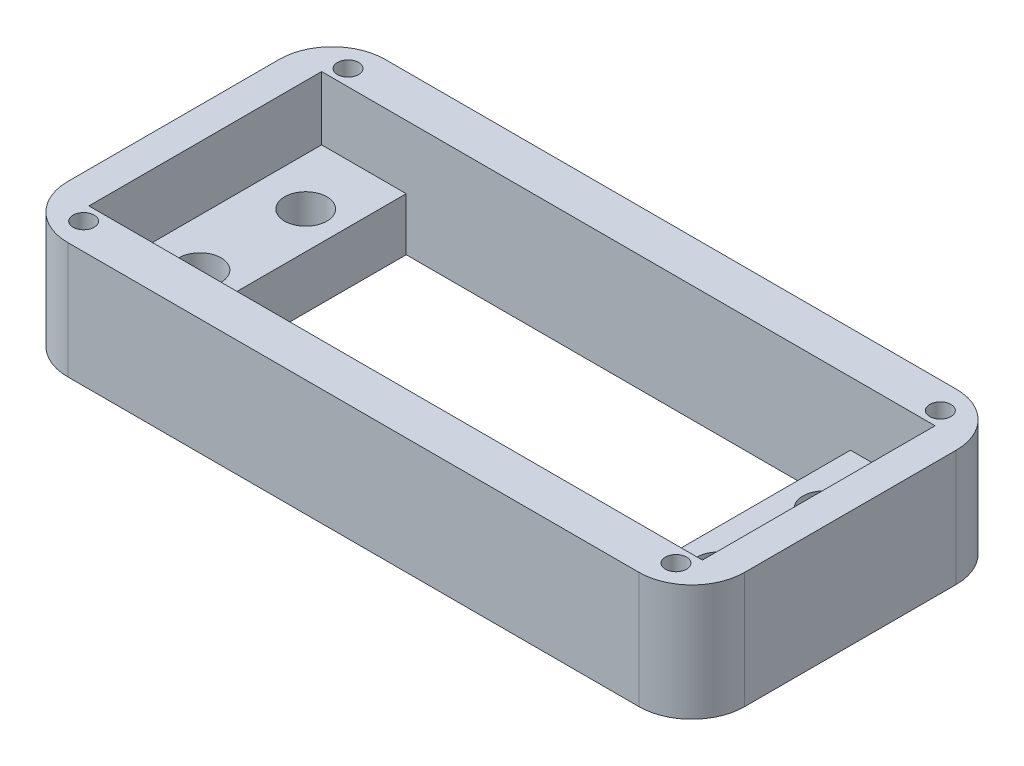
ISO-10303-21;
HEADER;
FILE_DESCRIPTION(('STEP AP214'),'2;1');
FILE_NAME('part.step','',(''),(''),'','','');
FILE_SCHEMA(('AUTOMOTIVE_DESIGN { 1 0 10303 214 1 1 1 1 }'));
ENDSEC;
DATA;
#1=APPLICATION_CONTEXT('core data for automotive mechanical design processes');
#2=APPLICATION_PROTOCOL_DEFINITION('international standard','automotive_design',2000,#1);
#3=PRODUCT_CONTEXT('',#1,'mechanical');
#4=PRODUCT('Part','Part','',(#3));
#5=PRODUCT_RELATED_PRODUCT_CATEGORY('part','',(#4));
#6=PRODUCT_DEFINITION_FORMATION('','',#4);
#7=PRODUCT_DEFINITION_CONTEXT('part definition',#1,'design');
#8=PRODUCT_DEFINITION('design','',#6,#7);
#9=PRODUCT_DEFINITION_SHAPE('','',#8);
#10=(LENGTH_UNIT() NAMED_UNIT(*) SI_UNIT(.MILLI.,.METRE.));
#11=(NAMED_UNIT(*) PLANE_ANGLE_UNIT() SI_UNIT($,.RADIAN.));
#12=(NAMED_UNIT(*) SI_UNIT($,.STERADIAN.) SOLID_ANGLE_UNIT());
#13=UNCERTAINTY_MEASURE_WITH_UNIT(LENGTH_MEASURE(1.E-05),#10,'distance_accuracy_value','');
#14=(GEOMETRIC_REPRESENTATION_CONTEXT(3) GLOBAL_UNCERTAINTY_ASSIGNED_CONTEXT((#13)) GLOBAL_UNIT_ASSIGNED_CONTEXT((#10,
#11,#12)) REPRESENTATION_CONTEXT('',''));
#15=CARTESIAN_POINT('',(0.,0.,0.));
#16=DIRECTION('',(0.,0.,1.));
#17=DIRECTION('',(1.,0.,0.));
#18=AXIS2_PLACEMENT_3D('',#15,#16,#17);
#19=CARTESIAN_POINT('',(0.,64.,0.));
#20=DIRECTION('',(1.,0.,0.));
#21=DIRECTION('',(0.,0.,-1.));
#22=AXIS2_PLACEMENT_3D('',#19,#20,#21);
#23=PLANE('',#22);
#24=DIRECTION('',(0.,0.,1.));
#25=VECTOR('',#24,1.);
#26=CARTESIAN_POINT('',(0.,70.,-25.));
#27=LINE('',#26,#25);
#28=CARTESIAN_POINT('',(0.,70.,-25.));
#29=VERTEX_POINT('',#28);
#30=CARTESIAN_POINT('',(0.,70.,-5.));
#31=VERTEX_POINT('',#30);
#32=EDGE_CURVE('E56',#29,#31,#27,.T.);
#33=ORIENTED_EDGE('',*,*,#32,.F.);
#34=DIRECTION('',(0.,-1.,0.));
#35=VECTOR('',#34,1.);
#36=CARTESIAN_POINT('',(0.,64.,-25.));
#37=LINE('',#36,#35);
#38=CARTESIAN_POINT('',(0.,59.,-25.));
#39=VERTEX_POINT('',#38);
#40=EDGE_CURVE('E49',#29,#39,#37,.T.);
#41=ORIENTED_EDGE('',*,*,#40,.T.);
#42=DIRECTION('',(0.,0.,1.));
#43=VECTOR('',#42,1.);
#44=CARTESIAN_POINT('',(0.,59.,-5.));
#45=LINE('',#44,#43);
#46=CARTESIAN_POINT('',(0.,59.,-5.));
#47=VERTEX_POINT('',#46);
#48=EDGE_CURVE('E194',#39,#47,#45,.T.);
#49=ORIENTED_EDGE('',*,*,#48,.T.);
#50=DIRECTION('',(0.,-1.,0.));
#51=VECTOR('',#50,1.);
#52=CARTESIAN_POINT('',(0.,64.,-5.));
#53=LINE('',#52,#51);
#54=EDGE_CURVE('E188',#47,#31,#53,.F.);
#55=ORIENTED_EDGE('',*,*,#54,.T.);
#56=EDGE_LOOP('',(#33,#41,#49,#55));
#57=FACE_BOUND('',#56,.T.);
#58=ADVANCED_FACE('F41',(#57),#23,.F.);
#59=CARTESIAN_POINT('',(0.,64.,0.));
#60=DIRECTION('',(0.,0.,-1.));
#61=DIRECTION('',(-1.,0.,0.));
#62=AXIS2_PLACEMENT_3D('',#59,#60,#61);
#63=PLANE('',#62);
#64=DIRECTION('',(1.,0.,0.));
#65=VECTOR('',#64,1.);
#66=CARTESIAN_POINT('',(5.,70.,0.));
#67=LINE('',#66,#65);
#68=CARTESIAN_POINT('',(5.,70.,0.));
#69=VERTEX_POINT('',#68);
#70=CARTESIAN_POINT('',(59.,70.,0.));
#71=VERTEX_POINT('',#70);
#72=EDGE_CURVE('E158',#69,#71,#67,.T.);
#73=ORIENTED_EDGE('',*,*,#72,.F.);
#74=DIRECTION('',(0.,-1.,0.));
#75=VECTOR('',#74,1.);
#76=CARTESIAN_POINT('',(5.,64.,0.));
#77=LINE('',#76,#75);
#78=CARTESIAN_POINT('',(5.,59.,0.));
#79=VERTEX_POINT('',#78);
#80=EDGE_CURVE('E179',#69,#79,#77,.T.);
#81=ORIENTED_EDGE('',*,*,#80,.T.);
#82=DIRECTION('',(1.,0.,0.));
#83=VECTOR('',#82,1.);
#84=CARTESIAN_POINT('',(59.,59.,0.));
#85=LINE('',#84,#83);
#86=CARTESIAN_POINT('',(59.,59.,0.));
#87=VERTEX_POINT('',#86);
#88=EDGE_CURVE('E365',#79,#87,#85,.T.);
#89=ORIENTED_EDGE('',*,*,#88,.T.);
#90=DIRECTION('',(0.,-1.,0.));
#91=VECTOR('',#90,1.);
#92=CARTESIAN_POINT('',(59.,64.,0.));
#93=LINE('',#92,#91);
#94=EDGE_CURVE('E186',#87,#71,#93,.F.);
#95=ORIENTED_EDGE('',*,*,#94,.T.);
#96=EDGE_LOOP('',(#73,#81,#89,#95));
#97=FACE_BOUND('',#96,.T.);
#98=ADVANCED_FACE('F380',(#97),#63,.F.);
#99=CARTESIAN_POINT('',(64.,64.,0.));
#100=DIRECTION('',(-1.,0.,0.));
#101=DIRECTION('',(0.,0.,1.));
#102=AXIS2_PLACEMENT_3D('',#99,#100,#101);
#103=PLANE('',#102);
#104=DIRECTION('',(0.,0.,-1.));
#105=VECTOR('',#104,1.);
#106=CARTESIAN_POINT('',(64.,70.,-5.));
#107=LINE('',#106,#105);
#108=CARTESIAN_POINT('',(64.,70.,-5.));
#109=VERTEX_POINT('',#108);
#110=CARTESIAN_POINT('',(64.,70.,-25.));
#111=VERTEX_POINT('',#110);
#112=EDGE_CURVE('E155',#109,#111,#107,.T.);
#113=ORIENTED_EDGE('',*,*,#112,.F.);
#114=DIRECTION('',(0.,-1.,0.));
#115=VECTOR('',#114,1.);
#116=CARTESIAN_POINT('',(64.,64.,-5.));
#117=LINE('',#116,#115);
#118=CARTESIAN_POINT('',(64.,59.,-5.));
#119=VERTEX_POINT('',#118);
#120=EDGE_CURVE('E168',#109,#119,#117,.T.);
#121=ORIENTED_EDGE('',*,*,#120,.T.);
#122=DIRECTION('',(0.,0.,-1.));
#123=VECTOR('',#122,1.);
#124=CARTESIAN_POINT('',(64.,59.,-25.));
#125=LINE('',#124,#123);
#126=CARTESIAN_POINT('',(64.,59.,-25.));
#127=VERTEX_POINT('',#126);
#128=EDGE_CURVE('E362',#119,#127,#125,.T.);
#129=ORIENTED_EDGE('',*,*,#128,.T.);
#130=DIRECTION('',(0.,-1.,0.));
#131=VECTOR('',#130,1.);
#132=CARTESIAN_POINT('',(64.,64.,-25.));
#133=LINE('',#132,#131);
#134=EDGE_CURVE('E171',#127,#111,#133,.F.);
#135=ORIENTED_EDGE('',*,*,#134,.T.);
#136=EDGE_LOOP('',(#113,#121,#129,#135));
#137=FACE_BOUND('',#136,.T.);
#138=ADVANCED_FACE('F166',(#137),#103,.F.);
#139=CARTESIAN_POINT('',(0.,64.,-30.));
#140=DIRECTION('',(0.,0.,1.));
#141=DIRECTION('',(1.,0.,0.));
#142=AXIS2_PLACEMENT_3D('',#139,#140,#141);
#143=PLANE('',#142);
#144=DIRECTION('',(-1.,0.,0.));
#145=VECTOR('',#144,1.);
#146=CARTESIAN_POINT('',(59.,70.,-30.));
#147=LINE('',#146,#145);
#148=CARTESIAN_POINT('',(59.,70.,-30.));
#149=VERTEX_POINT('',#148);
#150=CARTESIAN_POINT('',(5.,70.,-30.));
#151=VERTEX_POINT('',#150);
#152=EDGE_CURVE('E373',#149,#151,#147,.T.);
#153=ORIENTED_EDGE('',*,*,#152,.F.);
#154=DIRECTION('',(0.,-1.,0.));
#155=VECTOR('',#154,1.);
#156=CARTESIAN_POINT('',(59.,64.,-30.));
#157=LINE('',#156,#155);
#158=CARTESIAN_POINT('',(59.,59.,-30.));
#159=VERTEX_POINT('',#158);
#160=EDGE_CURVE('E177',#149,#159,#157,.T.);
#161=ORIENTED_EDGE('',*,*,#160,.T.);
#162=DIRECTION('',(-1.,0.,0.));
#163=VECTOR('',#162,1.);
#164=CARTESIAN_POINT('',(5.,59.,-30.));
#165=LINE('',#164,#163);
#166=CARTESIAN_POINT('',(5.,59.,-30.));
#167=VERTEX_POINT('',#166);
#168=EDGE_CURVE('E212',#159,#167,#165,.T.);
#169=ORIENTED_EDGE('',*,*,#168,.T.);
#170=DIRECTION('',(0.,-1.,0.));
#171=VECTOR('',#170,1.);
#172=CARTESIAN_POINT('',(5.,64.,-30.));
#173=LINE('',#172,#171);
#174=EDGE_CURVE('E181',#167,#151,#173,.F.);
#175=ORIENTED_EDGE('',*,*,#174,.T.);
#176=EDGE_LOOP('',(#153,#161,#169,#175));
#177=FACE_BOUND('',#176,.T.);
#178=ADVANCED_FACE('F377',(#177),#143,.F.);
#179=CARTESIAN_POINT('',(11.,-0.001000000000001,-26.));
#180=DIRECTION('',(0.,0.,-1.));
#181=DIRECTION('',(-1.,0.,0.));
#182=AXIS2_PLACEMENT_3D('',#179,#180,#181);
#183=PLANE('',#182);
#184=DIRECTION('',(1.,0.,0.));
#185=VECTOR('',#184,1.);
#186=CARTESIAN_POINT('',(11.,70.,-26.));
#187=LINE('',#186,#185);
#188=CARTESIAN_POINT('',(3.,70.,-26.));
#189=VERTEX_POINT('',#188);
#190=CARTESIAN_POINT('',(61.,70.,-26.));
#191=VERTEX_POINT('',#190);
#192=EDGE_CURVE('E64',#189,#191,#187,.T.);
#193=ORIENTED_EDGE('',*,*,#192,.F.);
#194=DIRECTION('',(0.,-1.,0.));
#195=VECTOR('',#194,1.);
#196=CARTESIAN_POINT('',(3.,76.,-26.));
#197=LINE('',#196,#195);
#198=CARTESIAN_POINT('',(3.,64.,-26.));
#199=VERTEX_POINT('',#198);
#200=EDGE_CURVE('E262',#189,#199,#197,.T.);
#201=ORIENTED_EDGE('',*,*,#200,.T.);
#202=DIRECTION('',(-1.,0.,0.));
#203=VECTOR('',#202,1.);
#204=CARTESIAN_POINT('',(3.,64.,-26.));
#205=LINE('',#204,#203);
#206=CARTESIAN_POINT('',(11.,64.,-26.));
#207=VERTEX_POINT('',#206);
#208=EDGE_CURVE('E263',#207,#199,#205,.T.);
#209=ORIENTED_EDGE('',*,*,#208,.F.);
#210=DIRECTION('',(0.,1.,0.));
#211=VECTOR('',#210,1.);
#212=CARTESIAN_POINT('',(11.,-0.001000000000001,-26.));
#213=LINE('',#212,#211);
#214=CARTESIAN_POINT('',(11.,59.,-26.));
#215=VERTEX_POINT('',#214);
#216=EDGE_CURVE('E290',#215,#207,#213,.T.);
#217=ORIENTED_EDGE('',*,*,#216,.F.);
#218=DIRECTION('',(-1.,0.,0.));
#219=VECTOR('',#218,1.);
#220=CARTESIAN_POINT('',(11.,59.,-26.));
#221=LINE('',#220,#219);
#222=CARTESIAN_POINT('',(53.,59.,-26.));
#223=VERTEX_POINT('',#222);
#224=EDGE_CURVE('E245',#223,#215,#221,.T.);
#225=ORIENTED_EDGE('',*,*,#224,.F.);
#226=DIRECTION('',(0.,1.,0.));
#227=VECTOR('',#226,1.);
#228=CARTESIAN_POINT('',(53.,-0.001000000000001,-26.));
#229=LINE('',#228,#227);
#230=CARTESIAN_POINT('',(53.,64.,-26.));
#231=VERTEX_POINT('',#230);
#232=EDGE_CURVE('E292',#223,#231,#229,.T.);
#233=ORIENTED_EDGE('',*,*,#232,.T.);
#234=CARTESIAN_POINT('',(61.,64.,-26.));
#235=VERTEX_POINT('',#234);
#236=EDGE_CURVE('E259',#235,#231,#205,.T.);
#237=ORIENTED_EDGE('',*,*,#236,.F.);
#238=DIRECTION('',(0.,-1.,0.));
#239=VECTOR('',#238,1.);
#240=CARTESIAN_POINT('',(61.,76.,-26.));
#241=LINE('',#240,#239);
#242=EDGE_CURVE('E265',#191,#235,#241,.T.);
#243=ORIENTED_EDGE('',*,*,#242,.F.);
#244=EDGE_LOOP('',(#193,#201,#209,#217,#225,#233,#237,#243));
#245=FACE_BOUND('',#244,.T.);
#246=ADVANCED_FACE('F310',(#245),#183,.F.);
#247=CARTESIAN_POINT('',(11.,-0.001000000000001,-4.));
#248=DIRECTION('',(0.,0.,1.));
#249=DIRECTION('',(1.,0.,0.));
#250=AXIS2_PLACEMENT_3D('',#247,#248,#249);
#251=PLANE('',#250);
#252=DIRECTION('',(-1.,0.,0.));
#253=VECTOR('',#252,1.);
#254=CARTESIAN_POINT('',(11.,70.,-4.));
#255=LINE('',#254,#253);
#256=CARTESIAN_POINT('',(61.,70.,-4.));
#257=VERTEX_POINT('',#256);
#258=CARTESIAN_POINT('',(3.,70.,-4.));
#259=VERTEX_POINT('',#258);
#260=EDGE_CURVE('E339',#257,#259,#255,.T.);
#261=ORIENTED_EDGE('',*,*,#260,.F.);
#262=DIRECTION('',(0.,-1.,0.));
#263=VECTOR('',#262,1.);
#264=CARTESIAN_POINT('',(61.,76.,-4.));
#265=LINE('',#264,#263);
#266=CARTESIAN_POINT('',(61.,64.,-4.));
#267=VERTEX_POINT('',#266);
#268=EDGE_CURVE('E267',#257,#267,#265,.T.);
#269=ORIENTED_EDGE('',*,*,#268,.T.);
#270=DIRECTION('',(1.,0.,0.));
#271=VECTOR('',#270,1.);
#272=CARTESIAN_POINT('',(3.,64.,-4.));
#273=LINE('',#272,#271);
#274=CARTESIAN_POINT('',(53.,64.,-4.));
#275=VERTEX_POINT('',#274);
#276=EDGE_CURVE('E256',#275,#267,#273,.T.);
#277=ORIENTED_EDGE('',*,*,#276,.F.);
#278=DIRECTION('',(0.,1.,0.));
#279=VECTOR('',#278,1.);
#280=CARTESIAN_POINT('',(53.,-0.001000000000001,-4.));
#281=LINE('',#280,#279);
#282=CARTESIAN_POINT('',(53.,59.,-4.));
#283=VERTEX_POINT('',#282);
#284=EDGE_CURVE('E294',#283,#275,#281,.T.);
#285=ORIENTED_EDGE('',*,*,#284,.F.);
#286=DIRECTION('',(1.,0.,0.));
#287=VECTOR('',#286,1.);
#288=CARTESIAN_POINT('',(11.,59.,-4.));
#289=LINE('',#288,#287);
#290=CARTESIAN_POINT('',(11.,59.,-4.));
#291=VERTEX_POINT('',#290);
#292=EDGE_CURVE('E241',#291,#283,#289,.T.);
#293=ORIENTED_EDGE('',*,*,#292,.F.);
#294=DIRECTION('',(0.,1.,0.));
#295=VECTOR('',#294,1.);
#296=CARTESIAN_POINT('',(11.,-0.001000000000001,-4.));
#297=LINE('',#296,#295);
#298=CARTESIAN_POINT('',(11.,64.,-4.));
#299=VERTEX_POINT('',#298);
#300=EDGE_CURVE('E289',#291,#299,#297,.T.);
#301=ORIENTED_EDGE('',*,*,#300,.T.);
#302=CARTESIAN_POINT('',(3.,64.,-4.));
#303=VERTEX_POINT('',#302);
#304=EDGE_CURVE('E252',#303,#299,#273,.T.);
#305=ORIENTED_EDGE('',*,*,#304,.F.);
#306=DIRECTION('',(0.,-1.,0.));
#307=VECTOR('',#306,1.);
#308=CARTESIAN_POINT('',(3.,76.,-4.));
#309=LINE('',#308,#307);
#310=EDGE_CURVE('E269',#259,#303,#309,.T.);
#311=ORIENTED_EDGE('',*,*,#310,.F.);
#312=EDGE_LOOP('',(#261,#269,#277,#285,#293,#301,#305,#311));
#313=FACE_BOUND('',#312,.T.);
#314=ADVANCED_FACE('F322',(#313),#251,.F.);
#315=CARTESIAN_POINT('',(4.,-0.001000000000001,-27.5));
#316=DIRECTION('',(0.,1.,0.));
#317=DIRECTION('',(0.,0.,1.));
#318=AXIS2_PLACEMENT_3D('',#315,#316,#317);
#319=CYLINDRICAL_SURFACE('',#318,1.);
#320=CARTESIAN_POINT('',(4.,59.,-27.5));
#321=DIRECTION('',(0.,-1.,0.));
#322=DIRECTION('',(0.,0.,-1.));
#323=AXIS2_PLACEMENT_3D('',#320,#321,#322);
#324=CIRCLE('',#323,1.);
#325=CARTESIAN_POINT('',(4.,59.,-28.5));
#326=VERTEX_POINT('',#325);
#327=EDGE_CURVE('E226',#326,#326,#324,.F.);
#328=ORIENTED_EDGE('',*,*,#327,.F.);
#329=EDGE_LOOP('',(#328));
#330=FACE_BOUND('',#329,.T.);
#331=CARTESIAN_POINT('',(4.,70.,-27.5));
#332=DIRECTION('',(0.,1.,0.));
#333=DIRECTION('',(0.,0.,1.));
#334=AXIS2_PLACEMENT_3D('',#331,#332,#333);
#335=CIRCLE('',#334,1.);
#336=CARTESIAN_POINT('',(4.,70.,-26.5));
#337=VERTEX_POINT('',#336);
#338=EDGE_CURVE('E356',#337,#337,#335,.F.);
#339=ORIENTED_EDGE('',*,*,#338,.F.);
#340=EDGE_LOOP('',(#339));
#341=FACE_BOUND('',#340,.T.);
#342=ADVANCED_FACE('F431',(#330,#341),#319,.F.);
#343=CARTESIAN_POINT('',(4.00000000000001,-0.001000000000001,-2.5));
#344=DIRECTION('',(0.,1.,0.));
#345=DIRECTION('',(0.,0.,1.));
#346=AXIS2_PLACEMENT_3D('',#343,#344,#345);
#347=CYLINDRICAL_SURFACE('',#346,1.);
#348=CARTESIAN_POINT('',(4.00000000000001,59.,-2.5));
#349=DIRECTION('',(0.,-1.,0.));
#350=DIRECTION('',(0.,0.,-1.));
#351=AXIS2_PLACEMENT_3D('',#348,#349,#350);
#352=CIRCLE('',#351,1.);
#353=CARTESIAN_POINT('',(4.00000000000001,59.,-3.5));
#354=VERTEX_POINT('',#353);
#355=EDGE_CURVE('E223',#354,#354,#352,.F.);
#356=ORIENTED_EDGE('',*,*,#355,.F.);
#357=EDGE_LOOP('',(#356));
#358=FACE_BOUND('',#357,.T.);
#359=CARTESIAN_POINT('',(4.00000000000001,70.,-2.5));
#360=DIRECTION('',(0.,1.,0.));
#361=DIRECTION('',(0.,0.,1.));
#362=AXIS2_PLACEMENT_3D('',#359,#360,#361);
#363=CIRCLE('',#362,1.);
#364=CARTESIAN_POINT('',(4.00000000000001,70.,-1.5));
#365=VERTEX_POINT('',#364);
#366=EDGE_CURVE('E353',#365,#365,#363,.F.);
#367=ORIENTED_EDGE('',*,*,#366,.F.);
#368=EDGE_LOOP('',(#367));
#369=FACE_BOUND('',#368,.T.);
#370=ADVANCED_FACE('F459',(#358,#369),#347,.F.);
#371=CARTESIAN_POINT('',(60.,-0.001000000000001,-2.50000000000001));
#372=DIRECTION('',(0.,1.,0.));
#373=DIRECTION('',(0.,0.,1.));
#374=AXIS2_PLACEMENT_3D('',#371,#372,#373);
#375=CYLINDRICAL_SURFACE('',#374,0.999999999999998);
#376=CARTESIAN_POINT('',(60.,59.,-2.50000000000001));
#377=DIRECTION('',(0.,-1.,0.));
#378=DIRECTION('',(0.,0.,-1.));
#379=AXIS2_PLACEMENT_3D('',#376,#377,#378);
#380=CIRCLE('',#379,0.999999999999998);
#381=CARTESIAN_POINT('',(60.,59.,-3.5));
#382=VERTEX_POINT('',#381);
#383=EDGE_CURVE('E220',#382,#382,#380,.F.);
#384=ORIENTED_EDGE('',*,*,#383,.F.);
#385=EDGE_LOOP('',(#384));
#386=FACE_BOUND('',#385,.T.);
#387=CARTESIAN_POINT('',(60.,70.,-2.50000000000001));
#388=DIRECTION('',(0.,1.,0.));
#389=DIRECTION('',(0.,0.,1.));
#390=AXIS2_PLACEMENT_3D('',#387,#388,#389);
#391=CIRCLE('',#390,0.999999999999998);
#392=CARTESIAN_POINT('',(60.,70.,-1.50000000000001));
#393=VERTEX_POINT('',#392);
#394=EDGE_CURVE('E350',#393,#393,#391,.F.);
#395=ORIENTED_EDGE('',*,*,#394,.F.);
#396=EDGE_LOOP('',(#395));
#397=FACE_BOUND('',#396,.T.);
#398=ADVANCED_FACE('F467',(#386,#397),#375,.F.);
#399=CARTESIAN_POINT('',(60.,-0.001000000000001,-27.5));
#400=DIRECTION('',(0.,1.,0.));
#401=DIRECTION('',(0.,0.,1.));
#402=AXIS2_PLACEMENT_3D('',#399,#400,#401);
#403=CYLINDRICAL_SURFACE('',#402,0.999999999999998);
#404=CARTESIAN_POINT('',(60.,59.,-27.5));
#405=DIRECTION('',(0.,-1.,0.));
#406=DIRECTION('',(0.,0.,-1.));
#407=AXIS2_PLACEMENT_3D('',#404,#405,#406);
#408=CIRCLE('',#407,0.999999999999998);
#409=CARTESIAN_POINT('',(60.,59.,-28.5));
#410=VERTEX_POINT('',#409);
#411=EDGE_CURVE('E214',#410,#410,#408,.F.);
#412=ORIENTED_EDGE('',*,*,#411,.F.);
#413=EDGE_LOOP('',(#412));
#414=FACE_BOUND('',#413,.T.);
#415=CARTESIAN_POINT('',(60.,70.,-27.5));
#416=DIRECTION('',(0.,1.,0.));
#417=DIRECTION('',(0.,0.,1.));
#418=AXIS2_PLACEMENT_3D('',#415,#416,#417);
#419=CIRCLE('',#418,0.999999999999998);
#420=CARTESIAN_POINT('',(60.,70.,-26.5));
#421=VERTEX_POINT('',#420);
#422=EDGE_CURVE('E347',#421,#421,#419,.F.);
#423=ORIENTED_EDGE('',*,*,#422,.F.);
#424=EDGE_LOOP('',(#423));
#425=FACE_BOUND('',#424,.T.);
#426=ADVANCED_FACE('F393',(#414,#425),#403,.F.);
#427=CARTESIAN_POINT('',(59.,64.,-25.));
#428=DIRECTION('',(0.,-1.,0.));
#429=DIRECTION('',(0.,0.,-1.));
#430=AXIS2_PLACEMENT_3D('',#427,#428,#429);
#431=CYLINDRICAL_SURFACE('',#430,5.);
#432=ORIENTED_EDGE('',*,*,#160,.F.);
#433=CARTESIAN_POINT('',(59.,70.,-25.));
#434=DIRECTION('',(0.,1.,0.));
#435=DIRECTION('',(0.,0.,1.));
#436=AXIS2_PLACEMENT_3D('',#433,#434,#435);
#437=CIRCLE('',#436,5.);
#438=EDGE_CURVE('E172',#111,#149,#437,.T.);
#439=ORIENTED_EDGE('',*,*,#438,.F.);
#440=ORIENTED_EDGE('',*,*,#134,.F.);
#441=CARTESIAN_POINT('',(59.,59.,-25.));
#442=DIRECTION('',(0.,-1.,0.));
#443=DIRECTION('',(0.,0.,-1.));
#444=AXIS2_PLACEMENT_3D('',#441,#442,#443);
#445=CIRCLE('',#444,5.);
#446=EDGE_CURVE('E359',#127,#159,#445,.F.);
#447=ORIENTED_EDGE('',*,*,#446,.T.);
#448=EDGE_LOOP('',(#432,#439,#440,#447));
#449=FACE_BOUND('',#448,.T.);
#450=ADVANCED_FACE('F378',(#449),#431,.T.);
#451=CARTESIAN_POINT('',(59.,64.,-5.));
#452=DIRECTION('',(0.,-1.,0.));
#453=DIRECTION('',(0.,0.,-1.));
#454=AXIS2_PLACEMENT_3D('',#451,#452,#453);
#455=CYLINDRICAL_SURFACE('',#454,5.);
#456=ORIENTED_EDGE('',*,*,#120,.F.);
#457=CARTESIAN_POINT('',(59.,70.,-5.));
#458=DIRECTION('',(0.,1.,0.));
#459=DIRECTION('',(0.,0.,1.));
#460=AXIS2_PLACEMENT_3D('',#457,#458,#459);
#461=CIRCLE('',#460,5.);
#462=EDGE_CURVE('E151',#71,#109,#461,.T.);
#463=ORIENTED_EDGE('',*,*,#462,.F.);
#464=ORIENTED_EDGE('',*,*,#94,.F.);
#465=CARTESIAN_POINT('',(59.,59.,-5.));
#466=DIRECTION('',(0.,-1.,0.));
#467=DIRECTION('',(0.,0.,-1.));
#468=AXIS2_PLACEMENT_3D('',#465,#466,#467);
#469=CIRCLE('',#468,5.);
#470=EDGE_CURVE('E176',#87,#119,#469,.F.);
#471=ORIENTED_EDGE('',*,*,#470,.T.);
#472=EDGE_LOOP('',(#456,#463,#464,#471));
#473=FACE_BOUND('',#472,.T.);
#474=ADVANCED_FACE('F175',(#473),#455,.T.);
#475=CARTESIAN_POINT('',(5.,64.,-25.));
#476=DIRECTION('',(0.,-1.,0.));
#477=DIRECTION('',(0.,0.,-1.));
#478=AXIS2_PLACEMENT_3D('',#475,#476,#477);
#479=CYLINDRICAL_SURFACE('',#478,5.);
#480=ORIENTED_EDGE('',*,*,#40,.F.);
#481=CARTESIAN_POINT('',(5.,70.,-25.));
#482=DIRECTION('',(0.,1.,0.));
#483=DIRECTION('',(0.,0.,1.));
#484=AXIS2_PLACEMENT_3D('',#481,#482,#483);
#485=CIRCLE('',#484,5.);
#486=EDGE_CURVE('E369',#151,#29,#485,.T.);
#487=ORIENTED_EDGE('',*,*,#486,.F.);
#488=ORIENTED_EDGE('',*,*,#174,.F.);
#489=CARTESIAN_POINT('',(5.,59.,-25.));
#490=DIRECTION('',(0.,-1.,0.));
#491=DIRECTION('',(0.,0.,-1.));
#492=AXIS2_PLACEMENT_3D('',#489,#490,#491);
#493=CIRCLE('',#492,5.);
#494=EDGE_CURVE('E203',#167,#39,#493,.F.);
#495=ORIENTED_EDGE('',*,*,#494,.T.);
#496=EDGE_LOOP('',(#480,#487,#488,#495));
#497=FACE_BOUND('',#496,.T.);
#498=ADVANCED_FACE('F210',(#497),#479,.T.);
#499=CARTESIAN_POINT('',(5.,64.,-5.));
#500=DIRECTION('',(0.,-1.,0.));
#501=DIRECTION('',(0.,0.,-1.));
#502=AXIS2_PLACEMENT_3D('',#499,#500,#501);
#503=CYLINDRICAL_SURFACE('',#502,5.);
#504=ORIENTED_EDGE('',*,*,#80,.F.);
#505=CARTESIAN_POINT('',(5.,70.,-5.));
#506=DIRECTION('',(0.,1.,0.));
#507=DIRECTION('',(0.,0.,1.));
#508=AXIS2_PLACEMENT_3D('',#505,#506,#507);
#509=CIRCLE('',#508,5.);
#510=EDGE_CURVE('E342',#31,#69,#509,.T.);
#511=ORIENTED_EDGE('',*,*,#510,.F.);
#512=ORIENTED_EDGE('',*,*,#54,.F.);
#513=CARTESIAN_POINT('',(5.,59.,-5.));
#514=DIRECTION('',(0.,-1.,0.));
#515=DIRECTION('',(0.,0.,-1.));
#516=AXIS2_PLACEMENT_3D('',#513,#514,#515);
#517=CIRCLE('',#516,5.);
#518=EDGE_CURVE('E207',#47,#79,#517,.F.);
#519=ORIENTED_EDGE('',*,*,#518,.T.);
#520=EDGE_LOOP('',(#504,#511,#512,#519));
#521=FACE_BOUND('',#520,.T.);
#522=ADVANCED_FACE('F43',(#521),#503,.T.);
#523=CARTESIAN_POINT('',(3.,76.,-4.));
#524=DIRECTION('',(1.,0.,0.));
#525=DIRECTION('',(0.,0.,-1.));
#526=AXIS2_PLACEMENT_3D('',#523,#524,#525);
#527=PLANE('',#526);
#528=ORIENTED_EDGE('',*,*,#200,.F.);
#529=DIRECTION('',(0.,0.,1.));
#530=VECTOR('',#529,1.);
#531=CARTESIAN_POINT('',(3.,70.,-4.));
#532=LINE('',#531,#530);
#533=EDGE_CURVE('E319',#189,#259,#532,.T.);
#534=ORIENTED_EDGE('',*,*,#533,.T.);
#535=ORIENTED_EDGE('',*,*,#310,.T.);
#536=DIRECTION('',(0.,0.,1.));
#537=VECTOR('',#536,1.);
#538=CARTESIAN_POINT('',(3.,64.,-4.));
#539=LINE('',#538,#537);
#540=EDGE_CURVE('E249',#199,#303,#539,.T.);
#541=ORIENTED_EDGE('',*,*,#540,.F.);
#542=EDGE_LOOP('',(#528,#534,#535,#541));
#543=FACE_BOUND('',#542,.T.);
#544=ADVANCED_FACE('F316',(#543),#527,.T.);
#545=CARTESIAN_POINT('',(61.,76.,-26.));
#546=DIRECTION('',(-1.,0.,0.));
#547=DIRECTION('',(0.,0.,1.));
#548=AXIS2_PLACEMENT_3D('',#545,#546,#547);
#549=PLANE('',#548);
#550=ORIENTED_EDGE('',*,*,#268,.F.);
#551=DIRECTION('',(0.,0.,-1.));
#552=VECTOR('',#551,1.);
#553=CARTESIAN_POINT('',(61.,70.,-26.));
#554=LINE('',#553,#552);
#555=EDGE_CURVE('E12',#257,#191,#554,.T.);
#556=ORIENTED_EDGE('',*,*,#555,.T.);
#557=ORIENTED_EDGE('',*,*,#242,.T.);
#558=DIRECTION('',(0.,0.,-1.));
#559=VECTOR('',#558,1.);
#560=CARTESIAN_POINT('',(61.,64.,-26.));
#561=LINE('',#560,#559);
#562=EDGE_CURVE('E255',#267,#235,#561,.T.);
#563=ORIENTED_EDGE('',*,*,#562,.F.);
#564=EDGE_LOOP('',(#550,#556,#557,#563));
#565=FACE_BOUND('',#564,.T.);
#566=ADVANCED_FACE('F338',(#565),#549,.T.);
#567=CARTESIAN_POINT('',(11.,-0.001000000000001,-26.));
#568=DIRECTION('',(-1.,0.,0.));
#569=DIRECTION('',(0.,0.,1.));
#570=AXIS2_PLACEMENT_3D('',#567,#568,#569);
#571=PLANE('',#570);
#572=DIRECTION('',(0.,0.,1.));
#573=VECTOR('',#572,1.);
#574=CARTESIAN_POINT('',(11.,59.,-26.));
#575=LINE('',#574,#573);
#576=EDGE_CURVE('E247',#215,#291,#575,.T.);
#577=ORIENTED_EDGE('',*,*,#576,.F.);
#578=ORIENTED_EDGE('',*,*,#216,.T.);
#579=DIRECTION('',(0.,0.,1.));
#580=VECTOR('',#579,1.);
#581=CARTESIAN_POINT('',(11.,64.,-26.));
#582=LINE('',#581,#580);
#583=EDGE_CURVE('E283',#207,#299,#582,.T.);
#584=ORIENTED_EDGE('',*,*,#583,.T.);
#585=ORIENTED_EDGE('',*,*,#300,.F.);
#586=EDGE_LOOP('',(#577,#578,#584,#585));
#587=FACE_BOUND('',#586,.T.);
#588=ADVANCED_FACE('F327',(#587),#571,.F.);
#589=CARTESIAN_POINT('',(53.,-0.001000000000001,-26.));
#590=DIRECTION('',(1.,0.,0.));
#591=DIRECTION('',(0.,0.,-1.));
#592=AXIS2_PLACEMENT_3D('',#589,#590,#591);
#593=PLANE('',#592);
#594=DIRECTION('',(0.,0.,-1.));
#595=VECTOR('',#594,1.);
#596=CARTESIAN_POINT('',(53.,59.,-26.));
#597=LINE('',#596,#595);
#598=EDGE_CURVE('E243',#283,#223,#597,.T.);
#599=ORIENTED_EDGE('',*,*,#598,.F.);
#600=ORIENTED_EDGE('',*,*,#284,.T.);
#601=DIRECTION('',(0.,0.,-1.));
#602=VECTOR('',#601,1.);
#603=CARTESIAN_POINT('',(53.,64.,-26.));
#604=LINE('',#603,#602);
#605=EDGE_CURVE('E286',#275,#231,#604,.T.);
#606=ORIENTED_EDGE('',*,*,#605,.T.);
#607=ORIENTED_EDGE('',*,*,#232,.F.);
#608=EDGE_LOOP('',(#599,#600,#606,#607));
#609=FACE_BOUND('',#608,.T.);
#610=ADVANCED_FACE('F331',(#609),#593,.F.);
#611=CARTESIAN_POINT('',(7.5,-0.001000000000001,-20.));
#612=DIRECTION('',(0.,1.,0.));
#613=DIRECTION('',(0.,0.,1.));
#614=AXIS2_PLACEMENT_3D('',#611,#612,#613);
#615=CYLINDRICAL_SURFACE('',#614,2.);
#616=CARTESIAN_POINT('',(7.5,64.,-20.));
#617=DIRECTION('',(0.,1.,0.));
#618=DIRECTION('',(0.,0.,1.));
#619=AXIS2_PLACEMENT_3D('',#616,#617,#618);
#620=CIRCLE('',#619,2.);
#621=CARTESIAN_POINT('',(7.5,64.,-18.));
#622=VERTEX_POINT('',#621);
#623=EDGE_CURVE('E275',#622,#622,#620,.T.);
#624=ORIENTED_EDGE('',*,*,#623,.T.);
#625=EDGE_LOOP('',(#624));
#626=FACE_BOUND('',#625,.T.);
#627=CARTESIAN_POINT('',(7.5,59.,-20.));
#628=DIRECTION('',(0.,-1.,0.));
#629=DIRECTION('',(0.,0.,-1.));
#630=AXIS2_PLACEMENT_3D('',#627,#628,#629);
#631=CIRCLE('',#630,2.);
#632=CARTESIAN_POINT('',(7.5,59.,-22.));
#633=VERTEX_POINT('',#632);
#634=EDGE_CURVE('E238',#633,#633,#631,.F.);
#635=ORIENTED_EDGE('',*,*,#634,.F.);
#636=EDGE_LOOP('',(#635));
#637=FACE_BOUND('',#636,.T.);
#638=ADVANCED_FACE('F413',(#626,#637),#615,.F.);
#639=CARTESIAN_POINT('',(7.5,-0.001000000000001,-10.));
#640=DIRECTION('',(0.,1.,0.));
#641=DIRECTION('',(0.,0.,1.));
#642=AXIS2_PLACEMENT_3D('',#639,#640,#641);
#643=CYLINDRICAL_SURFACE('',#642,1.99999999999999);
#644=CARTESIAN_POINT('',(7.5,64.,-10.));
#645=DIRECTION('',(0.,1.,0.));
#646=DIRECTION('',(0.,0.,-1.));
#647=AXIS2_PLACEMENT_3D('',#644,#645,#646);
#648=CIRCLE('',#647,1.99999999999999);
#649=CARTESIAN_POINT('',(7.5,64.,-12.));
#650=VERTEX_POINT('',#649);
#651=EDGE_CURVE('E272',#650,#650,#648,.T.);
#652=ORIENTED_EDGE('',*,*,#651,.T.);
#653=EDGE_LOOP('',(#652));
#654=FACE_BOUND('',#653,.T.);
#655=CARTESIAN_POINT('',(7.5,59.,-10.));
#656=DIRECTION('',(0.,-1.,0.));
#657=DIRECTION('',(0.,0.,-1.));
#658=AXIS2_PLACEMENT_3D('',#655,#656,#657);
#659=CIRCLE('',#658,1.99999999999999);
#660=CARTESIAN_POINT('',(7.5,59.,-12.));
#661=VERTEX_POINT('',#660);
#662=EDGE_CURVE('E235',#661,#661,#659,.F.);
#663=ORIENTED_EDGE('',*,*,#662,.F.);
#664=EDGE_LOOP('',(#663));
#665=FACE_BOUND('',#664,.T.);
#666=ADVANCED_FACE('F409',(#654,#665),#643,.F.);
#667=CARTESIAN_POINT('',(56.5,-0.001000000000001,-10.));
#668=DIRECTION('',(0.,1.,0.));
#669=DIRECTION('',(0.,0.,1.));
#670=AXIS2_PLACEMENT_3D('',#667,#668,#669);
#671=CYLINDRICAL_SURFACE('',#670,2.);
#672=CARTESIAN_POINT('',(56.5,64.,-10.));
#673=DIRECTION('',(0.,1.,0.));
#674=DIRECTION('',(0.,0.,1.));
#675=AXIS2_PLACEMENT_3D('',#672,#673,#674);
#676=CIRCLE('',#675,2.);
#677=CARTESIAN_POINT('',(56.5,64.,-8.));
#678=VERTEX_POINT('',#677);
#679=EDGE_CURVE('E276',#678,#678,#676,.T.);
#680=ORIENTED_EDGE('',*,*,#679,.T.);
#681=EDGE_LOOP('',(#680));
#682=FACE_BOUND('',#681,.T.);
#683=CARTESIAN_POINT('',(56.5,59.,-10.));
#684=DIRECTION('',(0.,-1.,0.));
#685=DIRECTION('',(0.,0.,-1.));
#686=AXIS2_PLACEMENT_3D('',#683,#684,#685);
#687=CIRCLE('',#686,2.);
#688=CARTESIAN_POINT('',(56.5,59.,-12.));
#689=VERTEX_POINT('',#688);
#690=EDGE_CURVE('E232',#689,#689,#687,.F.);
#691=ORIENTED_EDGE('',*,*,#690,.F.);
#692=EDGE_LOOP('',(#691));
#693=FACE_BOUND('',#692,.T.);
#694=ADVANCED_FACE('F412',(#682,#693),#671,.F.);
#695=CARTESIAN_POINT('',(56.5,-0.001000000000001,-20.));
#696=DIRECTION('',(0.,1.,0.));
#697=DIRECTION('',(0.,0.,1.));
#698=AXIS2_PLACEMENT_3D('',#695,#696,#697);
#699=CYLINDRICAL_SURFACE('',#698,2.);
#700=CARTESIAN_POINT('',(56.5,64.,-20.));
#701=DIRECTION('',(0.,1.,0.));
#702=DIRECTION('',(0.,0.,-1.));
#703=AXIS2_PLACEMENT_3D('',#700,#701,#702);
#704=CIRCLE('',#703,2.);
#705=CARTESIAN_POINT('',(56.5,64.,-22.));
#706=VERTEX_POINT('',#705);
#707=EDGE_CURVE('E271',#706,#706,#704,.T.);
#708=ORIENTED_EDGE('',*,*,#707,.T.);
#709=EDGE_LOOP('',(#708));
#710=FACE_BOUND('',#709,.T.);
#711=CARTESIAN_POINT('',(56.5,59.,-20.));
#712=DIRECTION('',(0.,-1.,0.));
#713=DIRECTION('',(0.,0.,-1.));
#714=AXIS2_PLACEMENT_3D('',#711,#712,#713);
#715=CIRCLE('',#714,2.);
#716=CARTESIAN_POINT('',(56.5,59.,-22.));
#717=VERTEX_POINT('',#716);
#718=EDGE_CURVE('E229',#717,#717,#715,.F.);
#719=ORIENTED_EDGE('',*,*,#718,.F.);
#720=EDGE_LOOP('',(#719));
#721=FACE_BOUND('',#720,.T.);
#722=ADVANCED_FACE('F417',(#710,#721),#699,.F.);
#723=CARTESIAN_POINT('',(0.,64.,0.));
#724=DIRECTION('',(0.,-1.,0.));
#725=DIRECTION('',(0.,0.,-1.));
#726=AXIS2_PLACEMENT_3D('',#723,#724,#725);
#727=PLANE('',#726);
#728=ORIENTED_EDGE('',*,*,#679,.F.);
#729=EDGE_LOOP('',(#728));
#730=FACE_BOUND('',#729,.T.);
#731=ORIENTED_EDGE('',*,*,#707,.F.);
#732=EDGE_LOOP('',(#731));
#733=FACE_BOUND('',#732,.T.);
#734=ORIENTED_EDGE('',*,*,#605,.F.);
#735=ORIENTED_EDGE('',*,*,#276,.T.);
#736=ORIENTED_EDGE('',*,*,#562,.T.);
#737=ORIENTED_EDGE('',*,*,#236,.T.);
#738=EDGE_LOOP('',(#734,#735,#736,#737));
#739=FACE_BOUND('',#738,.T.);
#740=ADVANCED_FACE('F334',(#730,#733,#739),#727,.F.);
#741=ORIENTED_EDGE('',*,*,#651,.F.);
#742=EDGE_LOOP('',(#741));
#743=FACE_BOUND('',#742,.T.);
#744=ORIENTED_EDGE('',*,*,#623,.F.);
#745=EDGE_LOOP('',(#744));
#746=FACE_BOUND('',#745,.T.);
#747=ORIENTED_EDGE('',*,*,#540,.T.);
#748=ORIENTED_EDGE('',*,*,#304,.T.);
#749=ORIENTED_EDGE('',*,*,#583,.F.);
#750=ORIENTED_EDGE('',*,*,#208,.T.);
#751=EDGE_LOOP('',(#747,#748,#749,#750));
#752=FACE_BOUND('',#751,.T.);
#753=ADVANCED_FACE('F306',(#743,#746,#752),#727,.F.);
#754=CARTESIAN_POINT('',(0.,59.,0.));
#755=DIRECTION('',(0.,-1.,0.));
#756=DIRECTION('',(0.,0.,-1.));
#757=AXIS2_PLACEMENT_3D('',#754,#755,#756);
#758=PLANE('',#757);
#759=ORIENTED_EDGE('',*,*,#634,.T.);
#760=EDGE_LOOP('',(#759));
#761=FACE_BOUND('',#760,.T.);
#762=ORIENTED_EDGE('',*,*,#662,.T.);
#763=EDGE_LOOP('',(#762));
#764=FACE_BOUND('',#763,.T.);
#765=ORIENTED_EDGE('',*,*,#690,.T.);
#766=EDGE_LOOP('',(#765));
#767=FACE_BOUND('',#766,.T.);
#768=ORIENTED_EDGE('',*,*,#718,.T.);
#769=EDGE_LOOP('',(#768));
#770=FACE_BOUND('',#769,.T.);
#771=ORIENTED_EDGE('',*,*,#327,.T.);
#772=EDGE_LOOP('',(#771));
#773=FACE_BOUND('',#772,.T.);
#774=ORIENTED_EDGE('',*,*,#355,.T.);
#775=EDGE_LOOP('',(#774));
#776=FACE_BOUND('',#775,.T.);
#777=ORIENTED_EDGE('',*,*,#383,.T.);
#778=EDGE_LOOP('',(#777));
#779=FACE_BOUND('',#778,.T.);
#780=ORIENTED_EDGE('',*,*,#411,.T.);
#781=EDGE_LOOP('',(#780));
#782=FACE_BOUND('',#781,.T.);
#783=ORIENTED_EDGE('',*,*,#494,.F.);
#784=ORIENTED_EDGE('',*,*,#168,.F.);
#785=ORIENTED_EDGE('',*,*,#446,.F.);
#786=ORIENTED_EDGE('',*,*,#128,.F.);
#787=ORIENTED_EDGE('',*,*,#470,.F.);
#788=ORIENTED_EDGE('',*,*,#88,.F.);
#789=ORIENTED_EDGE('',*,*,#518,.F.);
#790=ORIENTED_EDGE('',*,*,#48,.F.);
#791=EDGE_LOOP('',(#783,#784,#785,#786,#787,#788,#789,#790));
#792=FACE_BOUND('',#791,.T.);
#793=ORIENTED_EDGE('',*,*,#576,.T.);
#794=ORIENTED_EDGE('',*,*,#292,.T.);
#795=ORIENTED_EDGE('',*,*,#598,.T.);
#796=ORIENTED_EDGE('',*,*,#224,.T.);
#797=EDGE_LOOP('',(#793,#794,#795,#796));
#798=FACE_BOUND('',#797,.T.);
#799=ADVANCED_FACE('F200',(#761,#764,#767,#770,#773,#776,#779,#782,#792,#798),#758,.T.);
#800=CARTESIAN_POINT('',(59.,70.,-5.));
#801=DIRECTION('',(0.,1.,0.));
#802=DIRECTION('',(0.,0.,1.));
#803=AXIS2_PLACEMENT_3D('',#800,#801,#802);
#804=PLANE('',#803);
#805=ORIENTED_EDGE('',*,*,#192,.T.);
#806=ORIENTED_EDGE('',*,*,#555,.F.);
#807=ORIENTED_EDGE('',*,*,#260,.T.);
#808=ORIENTED_EDGE('',*,*,#533,.F.);
#809=EDGE_LOOP('',(#805,#806,#807,#808));
#810=FACE_BOUND('',#809,.T.);
#811=ORIENTED_EDGE('',*,*,#462,.T.);
#812=ORIENTED_EDGE('',*,*,#112,.T.);
#813=ORIENTED_EDGE('',*,*,#438,.T.);
#814=ORIENTED_EDGE('',*,*,#152,.T.);
#815=ORIENTED_EDGE('',*,*,#486,.T.);
#816=ORIENTED_EDGE('',*,*,#32,.T.);
#817=ORIENTED_EDGE('',*,*,#510,.T.);
#818=ORIENTED_EDGE('',*,*,#72,.T.);
#819=EDGE_LOOP('',(#811,#812,#813,#814,#815,#816,#817,#818));
#820=FACE_BOUND('',#819,.T.);
#821=ORIENTED_EDGE('',*,*,#422,.T.);
#822=EDGE_LOOP('',(#821));
#823=FACE_BOUND('',#822,.T.);
#824=ORIENTED_EDGE('',*,*,#394,.T.);
#825=EDGE_LOOP('',(#824));
#826=FACE_BOUND('',#825,.T.);
#827=ORIENTED_EDGE('',*,*,#366,.T.);
#828=EDGE_LOOP('',(#827));
#829=FACE_BOUND('',#828,.T.);
#830=ORIENTED_EDGE('',*,*,#338,.T.);
#831=EDGE_LOOP('',(#830));
#832=FACE_BOUND('',#831,.T.);
#833=ADVANCED_FACE('F153',(#810,#820,#823,#826,#829,#832),#804,.T.);
#834=CLOSED_SHELL('',(#58,#98,#138,#178,#246,#314,#342,#370,#398,#426,#450,#474,#498,#522,#544,
#566,#588,#610,#638,#666,#694,#722,#740,#753,#799,#833));
#835=MANIFOLD_SOLID_BREP('B2',#834);
#836=ADVANCED_BREP_SHAPE_REPRESENTATION('',(#18,#835),#14);
#837=SHAPE_DEFINITION_REPRESENTATION(#9,#836);
ENDSEC;
END-ISO-10303-21;
